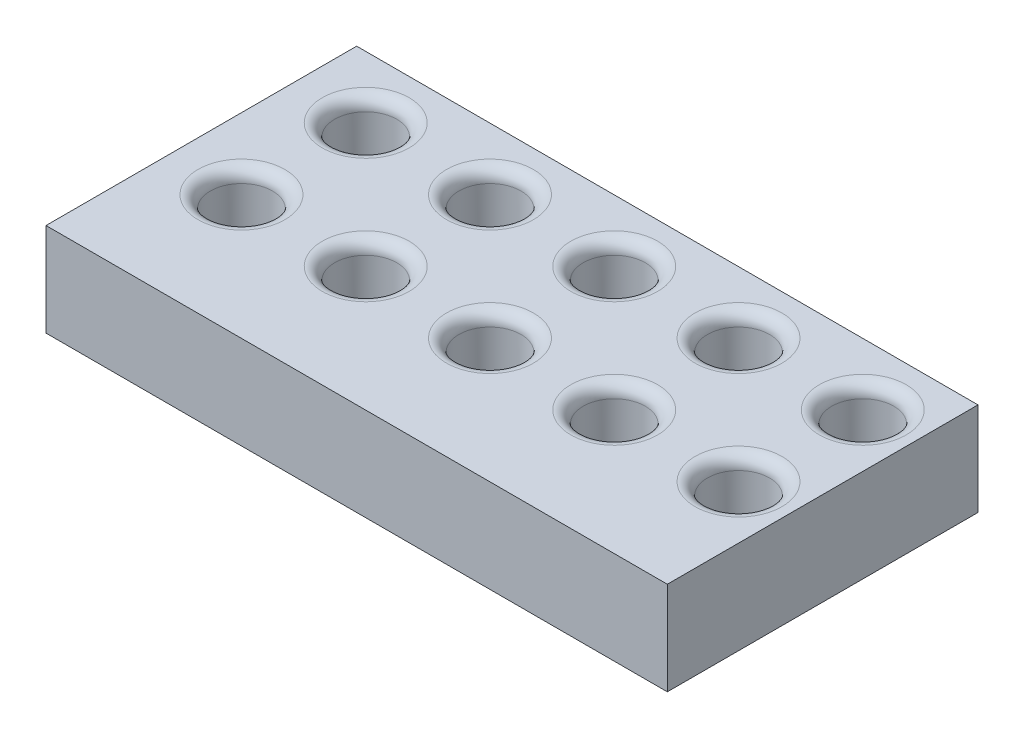
ISO-10303-21;
HEADER;
FILE_DESCRIPTION(('STEP AP214'),'2;1');
FILE_NAME('part.step','',(''),(''),'','','');
FILE_SCHEMA(('AUTOMOTIVE_DESIGN { 1 0 10303 214 1 1 1 1 }'));
ENDSEC;
DATA;
#1=APPLICATION_CONTEXT('core data for automotive mechanical design processes');
#2=APPLICATION_PROTOCOL_DEFINITION('international standard','automotive_design',2000,#1);
#3=PRODUCT_CONTEXT('',#1,'mechanical');
#4=PRODUCT('Part','Part','',(#3));
#5=PRODUCT_RELATED_PRODUCT_CATEGORY('part','',(#4));
#6=PRODUCT_DEFINITION_FORMATION('','',#4);
#7=PRODUCT_DEFINITION_CONTEXT('part definition',#1,'design');
#8=PRODUCT_DEFINITION('design','',#6,#7);
#9=PRODUCT_DEFINITION_SHAPE('','',#8);
#10=(LENGTH_UNIT() NAMED_UNIT(*) SI_UNIT(.MILLI.,.METRE.));
#11=(NAMED_UNIT(*) PLANE_ANGLE_UNIT() SI_UNIT($,.RADIAN.));
#12=(NAMED_UNIT(*) SI_UNIT($,.STERADIAN.) SOLID_ANGLE_UNIT());
#13=UNCERTAINTY_MEASURE_WITH_UNIT(LENGTH_MEASURE(1.E-05),#10,'distance_accuracy_value','');
#14=(GEOMETRIC_REPRESENTATION_CONTEXT(3) GLOBAL_UNCERTAINTY_ASSIGNED_CONTEXT((#13)) GLOBAL_UNIT_ASSIGNED_CONTEXT((#10,
#11,#12)) REPRESENTATION_CONTEXT('',''));
#15=CARTESIAN_POINT('',(0.,0.,0.));
#16=DIRECTION('',(0.,0.,1.));
#17=DIRECTION('',(1.,0.,0.));
#18=AXIS2_PLACEMENT_3D('',#15,#16,#17);
#19=CARTESIAN_POINT('',(50.,15.,25.));
#20=DIRECTION('',(-1.,0.,0.));
#21=DIRECTION('',(0.,0.,1.));
#22=AXIS2_PLACEMENT_3D('',#19,#20,#21);
#23=PLANE('',#22);
#24=DIRECTION('',(0.,0.,-1.));
#25=VECTOR('',#24,1.);
#26=CARTESIAN_POINT('',(50.,0.,25.));
#27=LINE('',#26,#25);
#28=CARTESIAN_POINT('',(50.,0.,25.));
#29=VERTEX_POINT('',#28);
#30=CARTESIAN_POINT('',(50.,0.,-25.));
#31=VERTEX_POINT('',#30);
#32=EDGE_CURVE('E101',#29,#31,#27,.T.);
#33=ORIENTED_EDGE('',*,*,#32,.T.);
#34=DIRECTION('',(0.,-1.,0.));
#35=VECTOR('',#34,1.);
#36=CARTESIAN_POINT('',(50.,15.,-25.));
#37=LINE('',#36,#35);
#38=CARTESIAN_POINT('',(50.,15.,-25.));
#39=VERTEX_POINT('',#38);
#40=EDGE_CURVE('E92',#39,#31,#37,.T.);
#41=ORIENTED_EDGE('',*,*,#40,.F.);
#42=DIRECTION('',(0.,0.,-1.));
#43=VECTOR('',#42,1.);
#44=CARTESIAN_POINT('',(50.,15.,25.));
#45=LINE('',#44,#43);
#46=CARTESIAN_POINT('',(50.,15.,25.));
#47=VERTEX_POINT('',#46);
#48=EDGE_CURVE('E86',#47,#39,#45,.T.);
#49=ORIENTED_EDGE('',*,*,#48,.F.);
#50=DIRECTION('',(0.,-1.,0.));
#51=VECTOR('',#50,1.);
#52=CARTESIAN_POINT('',(50.,15.,25.));
#53=LINE('',#52,#51);
#54=EDGE_CURVE('E97',#47,#29,#53,.T.);
#55=ORIENTED_EDGE('',*,*,#54,.T.);
#56=EDGE_LOOP('',(#33,#41,#49,#55));
#57=FACE_BOUND('',#56,.T.);
#58=ADVANCED_FACE('F33',(#57),#23,.F.);
#59=CARTESIAN_POINT('',(-50.,15.,-25.));
#60=DIRECTION('',(0.,0.,1.));
#61=DIRECTION('',(1.,0.,0.));
#62=AXIS2_PLACEMENT_3D('',#59,#60,#61);
#63=PLANE('',#62);
#64=DIRECTION('',(-1.,0.,0.));
#65=VECTOR('',#64,1.);
#66=CARTESIAN_POINT('',(-50.,0.,-25.));
#67=LINE('',#66,#65);
#68=CARTESIAN_POINT('',(-50.,0.,-25.));
#69=VERTEX_POINT('',#68);
#70=EDGE_CURVE('E91',#31,#69,#67,.T.);
#71=ORIENTED_EDGE('',*,*,#70,.T.);
#72=DIRECTION('',(0.,-1.,0.));
#73=VECTOR('',#72,1.);
#74=CARTESIAN_POINT('',(-50.,15.,-25.));
#75=LINE('',#74,#73);
#76=CARTESIAN_POINT('',(-50.,15.,-25.));
#77=VERTEX_POINT('',#76);
#78=EDGE_CURVE('E89',#77,#69,#75,.T.);
#79=ORIENTED_EDGE('',*,*,#78,.F.);
#80=DIRECTION('',(-1.,0.,0.));
#81=VECTOR('',#80,1.);
#82=CARTESIAN_POINT('',(-50.,15.,-25.));
#83=LINE('',#82,#81);
#84=EDGE_CURVE('E81',#39,#77,#83,.T.);
#85=ORIENTED_EDGE('',*,*,#84,.F.);
#86=ORIENTED_EDGE('',*,*,#40,.T.);
#87=EDGE_LOOP('',(#71,#79,#85,#86));
#88=FACE_BOUND('',#87,.T.);
#89=ADVANCED_FACE('F90',(#88),#63,.F.);
#90=CARTESIAN_POINT('',(-50.,15.,25.));
#91=DIRECTION('',(1.,0.,0.));
#92=DIRECTION('',(0.,0.,-1.));
#93=AXIS2_PLACEMENT_3D('',#90,#91,#92);
#94=PLANE('',#93);
#95=DIRECTION('',(0.,0.,1.));
#96=VECTOR('',#95,1.);
#97=CARTESIAN_POINT('',(-50.,0.,25.));
#98=LINE('',#97,#96);
#99=CARTESIAN_POINT('',(-50.,0.,25.));
#100=VERTEX_POINT('',#99);
#101=EDGE_CURVE('E67',#69,#100,#98,.T.);
#102=ORIENTED_EDGE('',*,*,#101,.T.);
#103=DIRECTION('',(0.,-1.,0.));
#104=VECTOR('',#103,1.);
#105=CARTESIAN_POINT('',(-50.,15.,25.));
#106=LINE('',#105,#104);
#107=CARTESIAN_POINT('',(-50.,15.,25.));
#108=VERTEX_POINT('',#107);
#109=EDGE_CURVE('E93',#108,#100,#106,.T.);
#110=ORIENTED_EDGE('',*,*,#109,.F.);
#111=DIRECTION('',(0.,0.,1.));
#112=VECTOR('',#111,1.);
#113=CARTESIAN_POINT('',(-50.,15.,25.));
#114=LINE('',#113,#112);
#115=EDGE_CURVE('E84',#77,#108,#114,.T.);
#116=ORIENTED_EDGE('',*,*,#115,.F.);
#117=ORIENTED_EDGE('',*,*,#78,.T.);
#118=EDGE_LOOP('',(#102,#110,#116,#117));
#119=FACE_BOUND('',#118,.T.);
#120=ADVANCED_FACE('F95',(#119),#94,.F.);
#121=CARTESIAN_POINT('',(-50.,15.,25.));
#122=DIRECTION('',(0.,0.,-1.));
#123=DIRECTION('',(-1.,0.,0.));
#124=AXIS2_PLACEMENT_3D('',#121,#122,#123);
#125=PLANE('',#124);
#126=DIRECTION('',(1.,0.,0.));
#127=VECTOR('',#126,1.);
#128=CARTESIAN_POINT('',(-50.,0.,25.));
#129=LINE('',#128,#127);
#130=EDGE_CURVE('E73',#100,#29,#129,.T.);
#131=ORIENTED_EDGE('',*,*,#130,.T.);
#132=ORIENTED_EDGE('',*,*,#54,.F.);
#133=DIRECTION('',(1.,0.,0.));
#134=VECTOR('',#133,1.);
#135=CARTESIAN_POINT('',(-50.,15.,25.));
#136=LINE('',#135,#134);
#137=EDGE_CURVE('E50',#108,#47,#136,.T.);
#138=ORIENTED_EDGE('',*,*,#137,.F.);
#139=ORIENTED_EDGE('',*,*,#109,.T.);
#140=EDGE_LOOP('',(#131,#132,#138,#139));
#141=FACE_BOUND('',#140,.T.);
#142=ADVANCED_FACE('F340',(#141),#125,.F.);
#143=CARTESIAN_POINT('',(0.,15.,0.));
#144=DIRECTION('',(0.,-1.,0.));
#145=DIRECTION('',(0.,0.,-1.));
#146=AXIS2_PLACEMENT_3D('',#143,#144,#145);
#147=PLANE('',#146);
#148=CARTESIAN_POINT('',(-38.5848843240238,15.,4.95817317088985));
#149=DIRECTION('',(0.,-1.,0.));
#150=DIRECTION('',(0.,0.,-1.));
#151=AXIS2_PLACEMENT_3D('',#148,#149,#150);
#152=CIRCLE('',#151,7.);
#153=CARTESIAN_POINT('',(-38.5848843240238,15.,-2.04182682911015));
#154=VERTEX_POINT('',#153);
#155=EDGE_CURVE('E141',#154,#154,#152,.T.);
#156=ORIENTED_EDGE('',*,*,#155,.T.);
#157=EDGE_LOOP('',(#156));
#158=FACE_BOUND('',#157,.T.);
#159=CARTESIAN_POINT('',(-18.5848843240238,15.,4.95817317088985));
#160=DIRECTION('',(0.,-1.,0.));
#161=DIRECTION('',(0.,0.,-1.));
#162=AXIS2_PLACEMENT_3D('',#159,#160,#161);
#163=CIRCLE('',#162,7.);
#164=CARTESIAN_POINT('',(-18.5848843240238,15.,-2.04182682911015));
#165=VERTEX_POINT('',#164);
#166=EDGE_CURVE('E138',#165,#165,#163,.T.);
#167=ORIENTED_EDGE('',*,*,#166,.T.);
#168=EDGE_LOOP('',(#167));
#169=FACE_BOUND('',#168,.T.);
#170=CARTESIAN_POINT('',(1.41511567597625,15.,4.95817317088985));
#171=DIRECTION('',(0.,-1.,0.));
#172=DIRECTION('',(0.,0.,-1.));
#173=AXIS2_PLACEMENT_3D('',#170,#171,#172);
#174=CIRCLE('',#173,7.);
#175=CARTESIAN_POINT('',(1.41511567597625,15.,-2.04182682911015));
#176=VERTEX_POINT('',#175);
#177=EDGE_CURVE('E135',#176,#176,#174,.T.);
#178=ORIENTED_EDGE('',*,*,#177,.T.);
#179=EDGE_LOOP('',(#178));
#180=FACE_BOUND('',#179,.T.);
#181=CARTESIAN_POINT('',(21.4151156759762,15.,4.95817317088985));
#182=DIRECTION('',(0.,-1.,0.));
#183=DIRECTION('',(0.,0.,-1.));
#184=AXIS2_PLACEMENT_3D('',#181,#182,#183);
#185=CIRCLE('',#184,7.);
#186=CARTESIAN_POINT('',(21.4151156759762,15.,-2.04182682911015));
#187=VERTEX_POINT('',#186);
#188=EDGE_CURVE('E132',#187,#187,#185,.T.);
#189=ORIENTED_EDGE('',*,*,#188,.T.);
#190=EDGE_LOOP('',(#189));
#191=FACE_BOUND('',#190,.T.);
#192=CARTESIAN_POINT('',(41.4151156759763,15.,4.95817317088985));
#193=DIRECTION('',(0.,-1.,0.));
#194=DIRECTION('',(0.,0.,-1.));
#195=AXIS2_PLACEMENT_3D('',#192,#193,#194);
#196=CIRCLE('',#195,7.);
#197=CARTESIAN_POINT('',(41.4151156759763,15.,-2.04182682911015));
#198=VERTEX_POINT('',#197);
#199=EDGE_CURVE('E129',#198,#198,#196,.T.);
#200=ORIENTED_EDGE('',*,*,#199,.T.);
#201=EDGE_LOOP('',(#200));
#202=FACE_BOUND('',#201,.T.);
#203=CARTESIAN_POINT('',(41.415115675976,15.,-15.0418268291101));
#204=DIRECTION('',(0.,-1.,0.));
#205=DIRECTION('',(0.,0.,-1.));
#206=AXIS2_PLACEMENT_3D('',#203,#204,#205);
#207=CIRCLE('',#206,7.);
#208=CARTESIAN_POINT('',(41.415115675976,15.,-22.0418268291101));
#209=VERTEX_POINT('',#208);
#210=EDGE_CURVE('E126',#209,#209,#207,.T.);
#211=ORIENTED_EDGE('',*,*,#210,.T.);
#212=EDGE_LOOP('',(#211));
#213=FACE_BOUND('',#212,.T.);
#214=CARTESIAN_POINT('',(21.415115675976,15.,-15.0418268291101));
#215=DIRECTION('',(0.,-1.,0.));
#216=DIRECTION('',(0.,0.,-1.));
#217=AXIS2_PLACEMENT_3D('',#214,#215,#216);
#218=CIRCLE('',#217,7.);
#219=CARTESIAN_POINT('',(21.415115675976,15.,-22.0418268291101));
#220=VERTEX_POINT('',#219);
#221=EDGE_CURVE('E123',#220,#220,#218,.T.);
#222=ORIENTED_EDGE('',*,*,#221,.T.);
#223=EDGE_LOOP('',(#222));
#224=FACE_BOUND('',#223,.T.);
#225=CARTESIAN_POINT('',(1.41511567597604,15.,-15.0418268291101));
#226=DIRECTION('',(0.,-1.,0.));
#227=DIRECTION('',(0.,0.,-1.));
#228=AXIS2_PLACEMENT_3D('',#225,#226,#227);
#229=CIRCLE('',#228,7.);
#230=CARTESIAN_POINT('',(1.41511567597604,15.,-22.0418268291101));
#231=VERTEX_POINT('',#230);
#232=EDGE_CURVE('E120',#231,#231,#229,.T.);
#233=ORIENTED_EDGE('',*,*,#232,.T.);
#234=EDGE_LOOP('',(#233));
#235=FACE_BOUND('',#234,.T.);
#236=CARTESIAN_POINT('',(-18.584884324024,15.,-15.0418268291101));
#237=DIRECTION('',(0.,-1.,0.));
#238=DIRECTION('',(0.,0.,-1.));
#239=AXIS2_PLACEMENT_3D('',#236,#237,#238);
#240=CIRCLE('',#239,7.);
#241=CARTESIAN_POINT('',(-18.584884324024,15.,-22.0418268291101));
#242=VERTEX_POINT('',#241);
#243=EDGE_CURVE('E117',#242,#242,#240,.T.);
#244=ORIENTED_EDGE('',*,*,#243,.T.);
#245=EDGE_LOOP('',(#244));
#246=FACE_BOUND('',#245,.T.);
#247=CARTESIAN_POINT('',(-38.584884324024,15.,-15.0418268291101));
#248=DIRECTION('',(0.,-1.,0.));
#249=DIRECTION('',(0.,0.,-1.));
#250=AXIS2_PLACEMENT_3D('',#247,#248,#249);
#251=CIRCLE('',#250,7.);
#252=CARTESIAN_POINT('',(-38.584884324024,15.,-22.0418268291101));
#253=VERTEX_POINT('',#252);
#254=EDGE_CURVE('E114',#253,#253,#251,.T.);
#255=ORIENTED_EDGE('',*,*,#254,.T.);
#256=EDGE_LOOP('',(#255));
#257=FACE_BOUND('',#256,.T.);
#258=ORIENTED_EDGE('',*,*,#48,.T.);
#259=ORIENTED_EDGE('',*,*,#84,.T.);
#260=ORIENTED_EDGE('',*,*,#115,.T.);
#261=ORIENTED_EDGE('',*,*,#137,.T.);
#262=EDGE_LOOP('',(#258,#259,#260,#261));
#263=FACE_BOUND('',#262,.T.);
#264=ADVANCED_FACE('F82',(#158,#169,#180,#191,#202,#213,#224,#235,#246,#257,#263),#147,.F.);
#265=CARTESIAN_POINT('',(0.,0.,0.));
#266=DIRECTION('',(0.,-1.,0.));
#267=DIRECTION('',(0.,0.,-1.));
#268=AXIS2_PLACEMENT_3D('',#265,#266,#267);
#269=PLANE('',#268);
#270=ORIENTED_EDGE('',*,*,#32,.F.);
#271=ORIENTED_EDGE('',*,*,#130,.F.);
#272=ORIENTED_EDGE('',*,*,#101,.F.);
#273=ORIENTED_EDGE('',*,*,#70,.F.);
#274=EDGE_LOOP('',(#270,#271,#272,#273));
#275=FACE_BOUND('',#274,.T.);
#276=ADVANCED_FACE('F336',(#275),#269,.T.);
#277=CARTESIAN_POINT('',(-38.584884324024,5.,-15.0418268291101));
#278=DIRECTION('',(0.,1.,0.));
#279=DIRECTION('',(0.,0.,1.));
#280=AXIS2_PLACEMENT_3D('',#277,#278,#279);
#281=CYLINDRICAL_SURFACE('',#280,5.);
#282=CARTESIAN_POINT('',(-38.584884324024,13.,-15.0418268291101));
#283=DIRECTION('',(0.,-1.,0.));
#284=DIRECTION('',(0.,0.,-1.));
#285=AXIS2_PLACEMENT_3D('',#282,#283,#284);
#286=CIRCLE('',#285,5.);
#287=CARTESIAN_POINT('',(-38.584884324024,13.,-20.0418268291101));
#288=VERTEX_POINT('',#287);
#289=EDGE_CURVE('E11',#288,#288,#286,.F.);
#290=ORIENTED_EDGE('',*,*,#289,.T.);
#291=EDGE_LOOP('',(#290));
#292=FACE_BOUND('',#291,.T.);
#293=CARTESIAN_POINT('',(-38.584884324024,5.,-15.0418268291101));
#294=DIRECTION('',(0.,1.,0.));
#295=DIRECTION('',(0.,0.,1.));
#296=AXIS2_PLACEMENT_3D('',#293,#294,#295);
#297=CIRCLE('',#296,5.);
#298=CARTESIAN_POINT('',(-38.584884324024,5.,-10.0418268291102));
#299=VERTEX_POINT('',#298);
#300=EDGE_CURVE('E104',#299,#299,#297,.T.);
#301=ORIENTED_EDGE('',*,*,#300,.F.);
#302=EDGE_LOOP('',(#301));
#303=FACE_BOUND('',#302,.T.);
#304=ADVANCED_FACE('F276',(#292,#303),#281,.F.);
#305=CARTESIAN_POINT('',(-38.584884324024,5.,-15.0418268291101));
#306=DIRECTION('',(0.,1.,0.));
#307=DIRECTION('',(0.,0.,1.));
#308=AXIS2_PLACEMENT_3D('',#305,#306,#307);
#309=PLANE('',#308);
#310=ORIENTED_EDGE('',*,*,#300,.T.);
#311=EDGE_LOOP('',(#310));
#312=FACE_BOUND('',#311,.T.);
#313=ADVANCED_FACE('F268',(#312),#309,.T.);
#314=CARTESIAN_POINT('',(-18.584884324024,5.,-15.0418268291101));
#315=DIRECTION('',(0.,1.,0.));
#316=DIRECTION('',(0.,0.,1.));
#317=AXIS2_PLACEMENT_3D('',#314,#315,#316);
#318=CYLINDRICAL_SURFACE('',#317,5.);
#319=CARTESIAN_POINT('',(-18.584884324024,13.,-15.0418268291101));
#320=DIRECTION('',(0.,-1.,0.));
#321=DIRECTION('',(0.,0.,-1.));
#322=AXIS2_PLACEMENT_3D('',#319,#320,#321);
#323=CIRCLE('',#322,5.);
#324=CARTESIAN_POINT('',(-18.584884324024,13.,-20.0418268291101));
#325=VERTEX_POINT('',#324);
#326=EDGE_CURVE('E42',#325,#325,#323,.F.);
#327=ORIENTED_EDGE('',*,*,#326,.T.);
#328=EDGE_LOOP('',(#327));
#329=FACE_BOUND('',#328,.T.);
#330=CARTESIAN_POINT('',(-18.584884324024,5.,-15.0418268291101));
#331=DIRECTION('',(0.,1.,0.));
#332=DIRECTION('',(0.,0.,1.));
#333=AXIS2_PLACEMENT_3D('',#330,#331,#332);
#334=CIRCLE('',#333,5.);
#335=CARTESIAN_POINT('',(-18.584884324024,5.,-10.0418268291102));
#336=VERTEX_POINT('',#335);
#337=EDGE_CURVE('E239',#336,#336,#334,.T.);
#338=ORIENTED_EDGE('',*,*,#337,.F.);
#339=EDGE_LOOP('',(#338));
#340=FACE_BOUND('',#339,.T.);
#341=ADVANCED_FACE('F167',(#329,#340),#318,.F.);
#342=CARTESIAN_POINT('',(-18.584884324024,5.,-15.0418268291101));
#343=DIRECTION('',(0.,1.,0.));
#344=DIRECTION('',(0.,0.,1.));
#345=AXIS2_PLACEMENT_3D('',#342,#343,#344);
#346=PLANE('',#345);
#347=ORIENTED_EDGE('',*,*,#337,.T.);
#348=EDGE_LOOP('',(#347));
#349=FACE_BOUND('',#348,.T.);
#350=ADVANCED_FACE('F266',(#349),#346,.T.);
#351=CARTESIAN_POINT('',(1.41511567597604,5.,-15.0418268291101));
#352=DIRECTION('',(0.,1.,0.));
#353=DIRECTION('',(0.,0.,1.));
#354=AXIS2_PLACEMENT_3D('',#351,#352,#353);
#355=CYLINDRICAL_SURFACE('',#354,5.);
#356=CARTESIAN_POINT('',(1.41511567597604,13.,-15.0418268291101));
#357=DIRECTION('',(0.,-1.,0.));
#358=DIRECTION('',(0.,0.,-1.));
#359=AXIS2_PLACEMENT_3D('',#356,#357,#358);
#360=CIRCLE('',#359,5.);
#361=CARTESIAN_POINT('',(1.41511567597604,13.,-20.0418268291101));
#362=VERTEX_POINT('',#361);
#363=EDGE_CURVE('E162',#362,#362,#360,.F.);
#364=ORIENTED_EDGE('',*,*,#363,.T.);
#365=EDGE_LOOP('',(#364));
#366=FACE_BOUND('',#365,.T.);
#367=CARTESIAN_POINT('',(1.41511567597604,5.,-15.0418268291101));
#368=DIRECTION('',(0.,1.,0.));
#369=DIRECTION('',(0.,0.,1.));
#370=AXIS2_PLACEMENT_3D('',#367,#368,#369);
#371=CIRCLE('',#370,5.);
#372=CARTESIAN_POINT('',(1.41511567597604,5.,-10.0418268291102));
#373=VERTEX_POINT('',#372);
#374=EDGE_CURVE('E235',#373,#373,#371,.T.);
#375=ORIENTED_EDGE('',*,*,#374,.F.);
#376=EDGE_LOOP('',(#375));
#377=FACE_BOUND('',#376,.T.);
#378=ADVANCED_FACE('F274',(#366,#377),#355,.F.);
#379=CARTESIAN_POINT('',(1.41511567597604,5.,-15.0418268291101));
#380=DIRECTION('',(0.,1.,0.));
#381=DIRECTION('',(0.,0.,1.));
#382=AXIS2_PLACEMENT_3D('',#379,#380,#381);
#383=PLANE('',#382);
#384=ORIENTED_EDGE('',*,*,#374,.T.);
#385=EDGE_LOOP('',(#384));
#386=FACE_BOUND('',#385,.T.);
#387=ADVANCED_FACE('F229',(#386),#383,.T.);
#388=CARTESIAN_POINT('',(21.415115675976,5.,-15.0418268291101));
#389=DIRECTION('',(0.,1.,0.));
#390=DIRECTION('',(0.,0.,1.));
#391=AXIS2_PLACEMENT_3D('',#388,#389,#390);
#392=CYLINDRICAL_SURFACE('',#391,5.);
#393=CARTESIAN_POINT('',(21.415115675976,13.,-15.0418268291101));
#394=DIRECTION('',(0.,-1.,0.));
#395=DIRECTION('',(0.,0.,-1.));
#396=AXIS2_PLACEMENT_3D('',#393,#394,#395);
#397=CIRCLE('',#396,5.);
#398=CARTESIAN_POINT('',(21.415115675976,13.,-20.0418268291101));
#399=VERTEX_POINT('',#398);
#400=EDGE_CURVE('E159',#399,#399,#397,.F.);
#401=ORIENTED_EDGE('',*,*,#400,.T.);
#402=EDGE_LOOP('',(#401));
#403=FACE_BOUND('',#402,.T.);
#404=CARTESIAN_POINT('',(21.415115675976,5.,-15.0418268291101));
#405=DIRECTION('',(0.,1.,0.));
#406=DIRECTION('',(0.,0.,1.));
#407=AXIS2_PLACEMENT_3D('',#404,#405,#406);
#408=CIRCLE('',#407,5.);
#409=CARTESIAN_POINT('',(21.415115675976,5.,-10.0418268291102));
#410=VERTEX_POINT('',#409);
#411=EDGE_CURVE('E233',#410,#410,#408,.T.);
#412=ORIENTED_EDGE('',*,*,#411,.F.);
#413=EDGE_LOOP('',(#412));
#414=FACE_BOUND('',#413,.T.);
#415=ADVANCED_FACE('F225',(#403,#414),#392,.F.);
#416=CARTESIAN_POINT('',(21.415115675976,5.,-15.0418268291101));
#417=DIRECTION('',(0.,1.,0.));
#418=DIRECTION('',(0.,0.,1.));
#419=AXIS2_PLACEMENT_3D('',#416,#417,#418);
#420=PLANE('',#419);
#421=ORIENTED_EDGE('',*,*,#411,.T.);
#422=EDGE_LOOP('',(#421));
#423=FACE_BOUND('',#422,.T.);
#424=ADVANCED_FACE('F228',(#423),#420,.T.);
#425=CARTESIAN_POINT('',(41.415115675976,5.,-15.0418268291101));
#426=DIRECTION('',(0.,1.,0.));
#427=DIRECTION('',(0.,0.,1.));
#428=AXIS2_PLACEMENT_3D('',#425,#426,#427);
#429=CYLINDRICAL_SURFACE('',#428,5.);
#430=CARTESIAN_POINT('',(41.415115675976,13.,-15.0418268291101));
#431=DIRECTION('',(0.,-1.,0.));
#432=DIRECTION('',(0.,0.,-1.));
#433=AXIS2_PLACEMENT_3D('',#430,#431,#432);
#434=CIRCLE('',#433,5.);
#435=CARTESIAN_POINT('',(41.415115675976,13.,-20.0418268291101));
#436=VERTEX_POINT('',#435);
#437=EDGE_CURVE('E156',#436,#436,#434,.F.);
#438=ORIENTED_EDGE('',*,*,#437,.T.);
#439=EDGE_LOOP('',(#438));
#440=FACE_BOUND('',#439,.T.);
#441=CARTESIAN_POINT('',(41.415115675976,5.,-15.0418268291101));
#442=DIRECTION('',(0.,1.,0.));
#443=DIRECTION('',(0.,0.,1.));
#444=AXIS2_PLACEMENT_3D('',#441,#442,#443);
#445=CIRCLE('',#444,5.);
#446=CARTESIAN_POINT('',(41.415115675976,5.,-10.0418268291102));
#447=VERTEX_POINT('',#446);
#448=EDGE_CURVE('E236',#447,#447,#445,.T.);
#449=ORIENTED_EDGE('',*,*,#448,.F.);
#450=EDGE_LOOP('',(#449));
#451=FACE_BOUND('',#450,.T.);
#452=ADVANCED_FACE('F286',(#440,#451),#429,.F.);
#453=CARTESIAN_POINT('',(41.415115675976,5.,-15.0418268291101));
#454=DIRECTION('',(0.,1.,0.));
#455=DIRECTION('',(0.,0.,1.));
#456=AXIS2_PLACEMENT_3D('',#453,#454,#455);
#457=PLANE('',#456);
#458=ORIENTED_EDGE('',*,*,#448,.T.);
#459=EDGE_LOOP('',(#458));
#460=FACE_BOUND('',#459,.T.);
#461=ADVANCED_FACE('F288',(#460),#457,.T.);
#462=CARTESIAN_POINT('',(-18.5848843240238,5.,4.95817317088985));
#463=DIRECTION('',(0.,1.,0.));
#464=DIRECTION('',(0.,0.,1.));
#465=AXIS2_PLACEMENT_3D('',#462,#463,#464);
#466=CYLINDRICAL_SURFACE('',#465,5.);
#467=CARTESIAN_POINT('',(-18.5848843240238,13.,4.95817317088985));
#468=DIRECTION('',(0.,-1.,0.));
#469=DIRECTION('',(0.,0.,-1.));
#470=AXIS2_PLACEMENT_3D('',#467,#468,#469);
#471=CIRCLE('',#470,5.);
#472=CARTESIAN_POINT('',(-18.5848843240238,13.,-0.0418268291101469));
#473=VERTEX_POINT('',#472);
#474=EDGE_CURVE('E144',#473,#473,#471,.F.);
#475=ORIENTED_EDGE('',*,*,#474,.T.);
#476=EDGE_LOOP('',(#475));
#477=FACE_BOUND('',#476,.T.);
#478=CARTESIAN_POINT('',(-18.5848843240238,5.,4.95817317088985));
#479=DIRECTION('',(0.,1.,0.));
#480=DIRECTION('',(0.,0.,1.));
#481=AXIS2_PLACEMENT_3D('',#478,#479,#480);
#482=CIRCLE('',#481,5.);
#483=CARTESIAN_POINT('',(-18.5848843240238,5.,9.95817317088985));
#484=VERTEX_POINT('',#483);
#485=EDGE_CURVE('E242',#484,#484,#482,.T.);
#486=ORIENTED_EDGE('',*,*,#485,.F.);
#487=EDGE_LOOP('',(#486));
#488=FACE_BOUND('',#487,.T.);
#489=ADVANCED_FACE('F291',(#477,#488),#466,.F.);
#490=CARTESIAN_POINT('',(-18.5848843240238,5.,4.95817317088985));
#491=DIRECTION('',(0.,1.,0.));
#492=DIRECTION('',(0.,0.,1.));
#493=AXIS2_PLACEMENT_3D('',#490,#491,#492);
#494=PLANE('',#493);
#495=ORIENTED_EDGE('',*,*,#485,.T.);
#496=EDGE_LOOP('',(#495));
#497=FACE_BOUND('',#496,.T.);
#498=ADVANCED_FACE('F296',(#497),#494,.T.);
#499=CARTESIAN_POINT('',(1.41511567597625,5.,4.95817317088985));
#500=DIRECTION('',(0.,1.,0.));
#501=DIRECTION('',(0.,0.,1.));
#502=AXIS2_PLACEMENT_3D('',#499,#500,#501);
#503=CYLINDRICAL_SURFACE('',#502,5.);
#504=CARTESIAN_POINT('',(1.41511567597625,13.,4.95817317088985));
#505=DIRECTION('',(0.,-1.,0.));
#506=DIRECTION('',(0.,0.,-1.));
#507=AXIS2_PLACEMENT_3D('',#504,#505,#506);
#508=CIRCLE('',#507,5.);
#509=CARTESIAN_POINT('',(1.41511567597625,13.,-0.0418268291101469));
#510=VERTEX_POINT('',#509);
#511=EDGE_CURVE('E147',#510,#510,#508,.F.);
#512=ORIENTED_EDGE('',*,*,#511,.T.);
#513=EDGE_LOOP('',(#512));
#514=FACE_BOUND('',#513,.T.);
#515=CARTESIAN_POINT('',(1.41511567597625,5.,4.95817317088985));
#516=DIRECTION('',(0.,1.,0.));
#517=DIRECTION('',(0.,0.,1.));
#518=AXIS2_PLACEMENT_3D('',#515,#516,#517);
#519=CIRCLE('',#518,5.);
#520=CARTESIAN_POINT('',(1.41511567597625,5.,9.95817317088985));
#521=VERTEX_POINT('',#520);
#522=EDGE_CURVE('E248',#521,#521,#519,.T.);
#523=ORIENTED_EDGE('',*,*,#522,.F.);
#524=EDGE_LOOP('',(#523));
#525=FACE_BOUND('',#524,.T.);
#526=ADVANCED_FACE('F299',(#514,#525),#503,.F.);
#527=CARTESIAN_POINT('',(1.41511567597625,5.,4.95817317088985));
#528=DIRECTION('',(0.,1.,0.));
#529=DIRECTION('',(0.,0.,1.));
#530=AXIS2_PLACEMENT_3D('',#527,#528,#529);
#531=PLANE('',#530);
#532=ORIENTED_EDGE('',*,*,#522,.T.);
#533=EDGE_LOOP('',(#532));
#534=FACE_BOUND('',#533,.T.);
#535=ADVANCED_FACE('F304',(#534),#531,.T.);
#536=CARTESIAN_POINT('',(21.4151156759762,5.,4.95817317088985));
#537=DIRECTION('',(0.,1.,0.));
#538=DIRECTION('',(0.,0.,1.));
#539=AXIS2_PLACEMENT_3D('',#536,#537,#538);
#540=CYLINDRICAL_SURFACE('',#539,5.);
#541=CARTESIAN_POINT('',(21.4151156759762,13.,4.95817317088985));
#542=DIRECTION('',(0.,-1.,0.));
#543=DIRECTION('',(0.,0.,-1.));
#544=AXIS2_PLACEMENT_3D('',#541,#542,#543);
#545=CIRCLE('',#544,5.);
#546=CARTESIAN_POINT('',(21.4151156759762,13.,-0.0418268291101469));
#547=VERTEX_POINT('',#546);
#548=EDGE_CURVE('E150',#547,#547,#545,.F.);
#549=ORIENTED_EDGE('',*,*,#548,.T.);
#550=EDGE_LOOP('',(#549));
#551=FACE_BOUND('',#550,.T.);
#552=CARTESIAN_POINT('',(21.4151156759762,5.,4.95817317088985));
#553=DIRECTION('',(0.,1.,0.));
#554=DIRECTION('',(0.,0.,1.));
#555=AXIS2_PLACEMENT_3D('',#552,#553,#554);
#556=CIRCLE('',#555,5.);
#557=CARTESIAN_POINT('',(21.4151156759762,5.,9.95817317088985));
#558=VERTEX_POINT('',#557);
#559=EDGE_CURVE('E251',#558,#558,#556,.T.);
#560=ORIENTED_EDGE('',*,*,#559,.F.);
#561=EDGE_LOOP('',(#560));
#562=FACE_BOUND('',#561,.T.);
#563=ADVANCED_FACE('F307',(#551,#562),#540,.F.);
#564=CARTESIAN_POINT('',(21.4151156759762,5.,4.95817317088985));
#565=DIRECTION('',(0.,1.,0.));
#566=DIRECTION('',(0.,0.,1.));
#567=AXIS2_PLACEMENT_3D('',#564,#565,#566);
#568=PLANE('',#567);
#569=ORIENTED_EDGE('',*,*,#559,.T.);
#570=EDGE_LOOP('',(#569));
#571=FACE_BOUND('',#570,.T.);
#572=ADVANCED_FACE('F312',(#571),#568,.T.);
#573=CARTESIAN_POINT('',(41.4151156759763,5.,4.95817317088985));
#574=DIRECTION('',(0.,1.,0.));
#575=DIRECTION('',(0.,0.,1.));
#576=AXIS2_PLACEMENT_3D('',#573,#574,#575);
#577=CYLINDRICAL_SURFACE('',#576,5.);
#578=CARTESIAN_POINT('',(41.4151156759763,13.,4.95817317088985));
#579=DIRECTION('',(0.,-1.,0.));
#580=DIRECTION('',(0.,0.,-1.));
#581=AXIS2_PLACEMENT_3D('',#578,#579,#580);
#582=CIRCLE('',#581,5.);
#583=CARTESIAN_POINT('',(41.4151156759763,13.,-0.0418268291101469));
#584=VERTEX_POINT('',#583);
#585=EDGE_CURVE('E153',#584,#584,#582,.F.);
#586=ORIENTED_EDGE('',*,*,#585,.T.);
#587=EDGE_LOOP('',(#586));
#588=FACE_BOUND('',#587,.T.);
#589=CARTESIAN_POINT('',(41.4151156759763,5.,4.95817317088985));
#590=DIRECTION('',(0.,1.,0.));
#591=DIRECTION('',(0.,0.,1.));
#592=AXIS2_PLACEMENT_3D('',#589,#590,#591);
#593=CIRCLE('',#592,5.);
#594=CARTESIAN_POINT('',(41.4151156759763,5.,9.95817317088985));
#595=VERTEX_POINT('',#594);
#596=EDGE_CURVE('E254',#595,#595,#593,.T.);
#597=ORIENTED_EDGE('',*,*,#596,.F.);
#598=EDGE_LOOP('',(#597));
#599=FACE_BOUND('',#598,.T.);
#600=ADVANCED_FACE('F315',(#588,#599),#577,.F.);
#601=CARTESIAN_POINT('',(41.4151156759763,5.,4.95817317088985));
#602=DIRECTION('',(0.,1.,0.));
#603=DIRECTION('',(0.,0.,1.));
#604=AXIS2_PLACEMENT_3D('',#601,#602,#603);
#605=PLANE('',#604);
#606=ORIENTED_EDGE('',*,*,#596,.T.);
#607=EDGE_LOOP('',(#606));
#608=FACE_BOUND('',#607,.T.);
#609=ADVANCED_FACE('F320',(#608),#605,.T.);
#610=CARTESIAN_POINT('',(-38.5848843240238,5.,4.95817317088985));
#611=DIRECTION('',(0.,1.,0.));
#612=DIRECTION('',(0.,0.,1.));
#613=AXIS2_PLACEMENT_3D('',#610,#611,#612);
#614=CYLINDRICAL_SURFACE('',#613,5.);
#615=CARTESIAN_POINT('',(-38.5848843240238,13.,4.95817317088985));
#616=DIRECTION('',(0.,-1.,0.));
#617=DIRECTION('',(0.,0.,-1.));
#618=AXIS2_PLACEMENT_3D('',#615,#616,#617);
#619=CIRCLE('',#618,5.);
#620=CARTESIAN_POINT('',(-38.5848843240238,13.,-0.0418268291101469));
#621=VERTEX_POINT('',#620);
#622=EDGE_CURVE('E111',#621,#621,#619,.F.);
#623=ORIENTED_EDGE('',*,*,#622,.T.);
#624=EDGE_LOOP('',(#623));
#625=FACE_BOUND('',#624,.T.);
#626=CARTESIAN_POINT('',(-38.5848843240238,5.,4.95817317088985));
#627=DIRECTION('',(0.,1.,0.));
#628=DIRECTION('',(0.,0.,1.));
#629=AXIS2_PLACEMENT_3D('',#626,#627,#628);
#630=CIRCLE('',#629,5.);
#631=CARTESIAN_POINT('',(-38.5848843240238,5.,9.95817317088985));
#632=VERTEX_POINT('',#631);
#633=EDGE_CURVE('E257',#632,#632,#630,.T.);
#634=ORIENTED_EDGE('',*,*,#633,.F.);
#635=EDGE_LOOP('',(#634));
#636=FACE_BOUND('',#635,.T.);
#637=ADVANCED_FACE('F323',(#625,#636),#614,.F.);
#638=CARTESIAN_POINT('',(-38.5848843240238,5.,4.95817317088985));
#639=DIRECTION('',(0.,1.,0.));
#640=DIRECTION('',(0.,0.,1.));
#641=AXIS2_PLACEMENT_3D('',#638,#639,#640);
#642=PLANE('',#641);
#643=ORIENTED_EDGE('',*,*,#633,.T.);
#644=EDGE_LOOP('',(#643));
#645=FACE_BOUND('',#644,.T.);
#646=ADVANCED_FACE('F196',(#645),#642,.T.);
#647=CARTESIAN_POINT('',(-38.5848843240238,13.,4.95817317088985));
#648=DIRECTION('',(0.,-1.,0.));
#649=DIRECTION('',(0.,0.,-1.));
#650=AXIS2_PLACEMENT_3D('',#647,#648,#649);
#651=TOROIDAL_SURFACE('',#650,7.,2.);
#652=ORIENTED_EDGE('',*,*,#155,.F.);
#653=EDGE_LOOP('',(#652));
#654=FACE_BOUND('',#653,.T.);
#655=ORIENTED_EDGE('',*,*,#622,.F.);
#656=EDGE_LOOP('',(#655));
#657=FACE_BOUND('',#656,.T.);
#658=ADVANCED_FACE('F192',(#654,#657),#651,.T.);
#659=CARTESIAN_POINT('',(-18.5848843240238,13.,4.95817317088985));
#660=DIRECTION('',(0.,-1.,0.));
#661=DIRECTION('',(0.,0.,-1.));
#662=AXIS2_PLACEMENT_3D('',#659,#660,#661);
#663=TOROIDAL_SURFACE('',#662,7.,2.);
#664=ORIENTED_EDGE('',*,*,#166,.F.);
#665=EDGE_LOOP('',(#664));
#666=FACE_BOUND('',#665,.T.);
#667=ORIENTED_EDGE('',*,*,#474,.F.);
#668=EDGE_LOOP('',(#667));
#669=FACE_BOUND('',#668,.T.);
#670=ADVANCED_FACE('F195',(#666,#669),#663,.T.);
#671=CARTESIAN_POINT('',(1.41511567597625,13.,4.95817317088985));
#672=DIRECTION('',(0.,-1.,0.));
#673=DIRECTION('',(0.,0.,-1.));
#674=AXIS2_PLACEMENT_3D('',#671,#672,#673);
#675=TOROIDAL_SURFACE('',#674,7.,2.);
#676=ORIENTED_EDGE('',*,*,#177,.F.);
#677=EDGE_LOOP('',(#676));
#678=FACE_BOUND('',#677,.T.);
#679=ORIENTED_EDGE('',*,*,#511,.F.);
#680=EDGE_LOOP('',(#679));
#681=FACE_BOUND('',#680,.T.);
#682=ADVANCED_FACE('F200',(#678,#681),#675,.T.);
#683=CARTESIAN_POINT('',(21.4151156759762,13.,4.95817317088985));
#684=DIRECTION('',(0.,-1.,0.));
#685=DIRECTION('',(0.,0.,-1.));
#686=AXIS2_PLACEMENT_3D('',#683,#684,#685);
#687=TOROIDAL_SURFACE('',#686,7.,2.);
#688=ORIENTED_EDGE('',*,*,#188,.F.);
#689=EDGE_LOOP('',(#688));
#690=FACE_BOUND('',#689,.T.);
#691=ORIENTED_EDGE('',*,*,#548,.F.);
#692=EDGE_LOOP('',(#691));
#693=FACE_BOUND('',#692,.T.);
#694=ADVANCED_FACE('F204',(#690,#693),#687,.T.);
#695=CARTESIAN_POINT('',(41.4151156759763,13.,4.95817317088985));
#696=DIRECTION('',(0.,-1.,0.));
#697=DIRECTION('',(0.,0.,-1.));
#698=AXIS2_PLACEMENT_3D('',#695,#696,#697);
#699=TOROIDAL_SURFACE('',#698,7.,2.);
#700=ORIENTED_EDGE('',*,*,#199,.F.);
#701=EDGE_LOOP('',(#700));
#702=FACE_BOUND('',#701,.T.);
#703=ORIENTED_EDGE('',*,*,#585,.F.);
#704=EDGE_LOOP('',(#703));
#705=FACE_BOUND('',#704,.T.);
#706=ADVANCED_FACE('F208',(#702,#705),#699,.T.);
#707=CARTESIAN_POINT('',(41.415115675976,13.,-15.0418268291101));
#708=DIRECTION('',(0.,-1.,0.));
#709=DIRECTION('',(0.,0.,-1.));
#710=AXIS2_PLACEMENT_3D('',#707,#708,#709);
#711=TOROIDAL_SURFACE('',#710,7.,2.);
#712=ORIENTED_EDGE('',*,*,#210,.F.);
#713=EDGE_LOOP('',(#712));
#714=FACE_BOUND('',#713,.T.);
#715=ORIENTED_EDGE('',*,*,#437,.F.);
#716=EDGE_LOOP('',(#715));
#717=FACE_BOUND('',#716,.T.);
#718=ADVANCED_FACE('F212',(#714,#717),#711,.T.);
#719=CARTESIAN_POINT('',(21.415115675976,13.,-15.0418268291101));
#720=DIRECTION('',(0.,-1.,0.));
#721=DIRECTION('',(0.,0.,-1.));
#722=AXIS2_PLACEMENT_3D('',#719,#720,#721);
#723=TOROIDAL_SURFACE('',#722,7.,2.);
#724=ORIENTED_EDGE('',*,*,#221,.F.);
#725=EDGE_LOOP('',(#724));
#726=FACE_BOUND('',#725,.T.);
#727=ORIENTED_EDGE('',*,*,#400,.F.);
#728=EDGE_LOOP('',(#727));
#729=FACE_BOUND('',#728,.T.);
#730=ADVANCED_FACE('F179',(#726,#729),#723,.T.);
#731=CARTESIAN_POINT('',(1.41511567597604,13.,-15.0418268291101));
#732=DIRECTION('',(0.,-1.,0.));
#733=DIRECTION('',(0.,0.,-1.));
#734=AXIS2_PLACEMENT_3D('',#731,#732,#733);
#735=TOROIDAL_SURFACE('',#734,7.,2.);
#736=ORIENTED_EDGE('',*,*,#232,.F.);
#737=EDGE_LOOP('',(#736));
#738=FACE_BOUND('',#737,.T.);
#739=ORIENTED_EDGE('',*,*,#363,.F.);
#740=EDGE_LOOP('',(#739));
#741=FACE_BOUND('',#740,.T.);
#742=ADVANCED_FACE('F172',(#738,#741),#735,.T.);
#743=CARTESIAN_POINT('',(-18.584884324024,13.,-15.0418268291101));
#744=DIRECTION('',(0.,-1.,0.));
#745=DIRECTION('',(0.,0.,-1.));
#746=AXIS2_PLACEMENT_3D('',#743,#744,#745);
#747=TOROIDAL_SURFACE('',#746,7.,2.);
#748=ORIENTED_EDGE('',*,*,#243,.F.);
#749=EDGE_LOOP('',(#748));
#750=FACE_BOUND('',#749,.T.);
#751=ORIENTED_EDGE('',*,*,#326,.F.);
#752=EDGE_LOOP('',(#751));
#753=FACE_BOUND('',#752,.T.);
#754=ADVANCED_FACE('F170',(#750,#753),#747,.T.);
#755=CARTESIAN_POINT('',(-38.584884324024,13.,-15.0418268291101));
#756=DIRECTION('',(0.,-1.,0.));
#757=DIRECTION('',(0.,0.,-1.));
#758=AXIS2_PLACEMENT_3D('',#755,#756,#757);
#759=TOROIDAL_SURFACE('',#758,7.,2.);
#760=ORIENTED_EDGE('',*,*,#254,.F.);
#761=EDGE_LOOP('',(#760));
#762=FACE_BOUND('',#761,.T.);
#763=ORIENTED_EDGE('',*,*,#289,.F.);
#764=EDGE_LOOP('',(#763));
#765=FACE_BOUND('',#764,.T.);
#766=ADVANCED_FACE('F35',(#762,#765),#759,.T.);
#767=CLOSED_SHELL('',(#58,#89,#120,#142,#264,#276,#304,#313,#341,#350,#378,#387,#415,#424,#452,
#461,#489,#498,#526,#535,#563,#572,#600,#609,#637,#646,#658,#670,#682,#694,#706,#718,#730,#742,
#754,#766));
#768=MANIFOLD_SOLID_BREP('B2',#767);
#769=ADVANCED_BREP_SHAPE_REPRESENTATION('',(#18,#768),#14);
#770=SHAPE_DEFINITION_REPRESENTATION(#9,#769);
ENDSEC;
END-ISO-10303-21;
